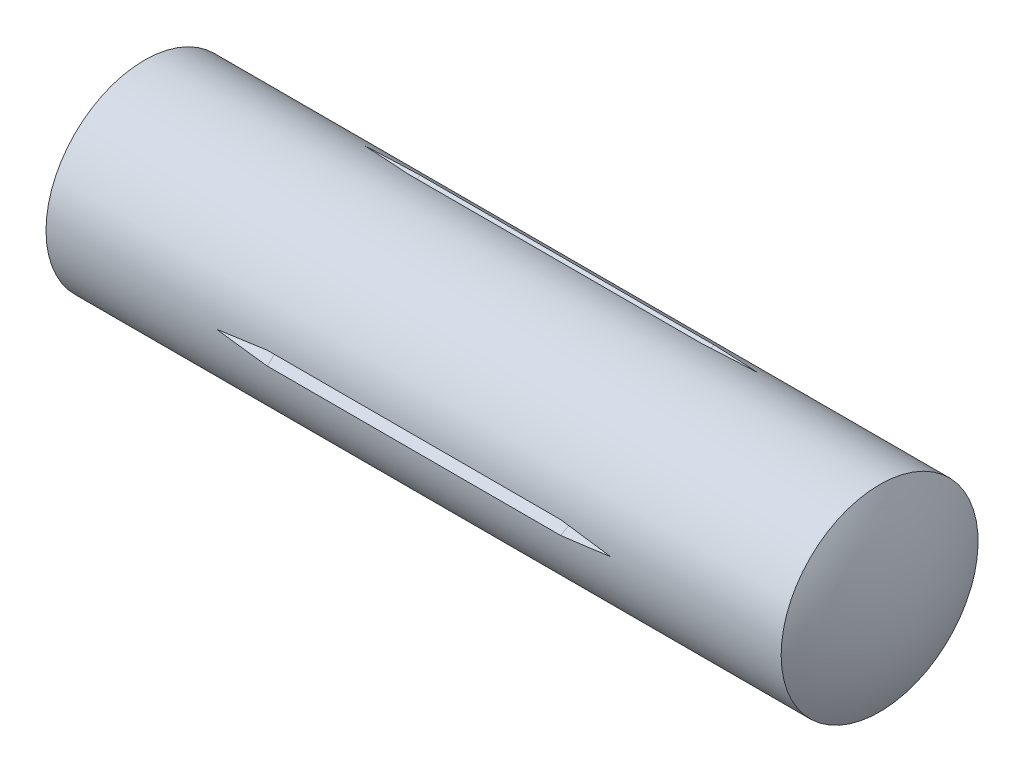
ISO-10303-21;
HEADER;
FILE_DESCRIPTION(('STEP AP214'),'2;1');
FILE_NAME('part.step','',(''),(''),'','','');
FILE_SCHEMA(('AUTOMOTIVE_DESIGN { 1 0 10303 214 1 1 1 1 }'));
ENDSEC;
DATA;
#1=APPLICATION_CONTEXT('core data for automotive mechanical design processes');
#2=APPLICATION_PROTOCOL_DEFINITION('international standard','automotive_design',2000,#1);
#3=PRODUCT_CONTEXT('',#1,'mechanical');
#4=PRODUCT('Part','Part','',(#3));
#5=PRODUCT_RELATED_PRODUCT_CATEGORY('part','',(#4));
#6=PRODUCT_DEFINITION_FORMATION('','',#4);
#7=PRODUCT_DEFINITION_CONTEXT('part definition',#1,'design');
#8=PRODUCT_DEFINITION('design','',#6,#7);
#9=PRODUCT_DEFINITION_SHAPE('','',#8);
#10=(LENGTH_UNIT() NAMED_UNIT(*) SI_UNIT(.MILLI.,.METRE.));
#11=(NAMED_UNIT(*) PLANE_ANGLE_UNIT() SI_UNIT($,.RADIAN.));
#12=(NAMED_UNIT(*) SI_UNIT($,.STERADIAN.) SOLID_ANGLE_UNIT());
#13=UNCERTAINTY_MEASURE_WITH_UNIT(LENGTH_MEASURE(1.E-05),#10,'distance_accuracy_value','');
#14=(GEOMETRIC_REPRESENTATION_CONTEXT(3) GLOBAL_UNCERTAINTY_ASSIGNED_CONTEXT((#13)) GLOBAL_UNIT_ASSIGNED_CONTEXT((#10,
#11,#12)) REPRESENTATION_CONTEXT('',''));
#15=CARTESIAN_POINT('',(0.,0.,0.));
#16=DIRECTION('',(0.,0.,1.));
#17=DIRECTION('',(1.,0.,0.));
#18=AXIS2_PLACEMENT_3D('',#15,#16,#17);
#19=CARTESIAN_POINT('',(-57.,0.,0.));
#20=DIRECTION('',(-1.,0.,0.));
#21=DIRECTION('',(0.,0.,1.));
#22=AXIS2_PLACEMENT_3D('',#19,#20,#21);
#23=CYLINDRICAL_SURFACE('',#22,12.5);
#24=CARTESIAN_POINT('',(-37.4999999999999,0.,0.));
#25=DIRECTION('',(-0.113967852703763,-0.0865878741022106,-0.989703929773219));
#26=DIRECTION('',(-0.993484438000965,0.00993295285175184,0.11353417061639));
#27=AXIS2_PLACEMENT_3D('',#24,#25,#26);
#28=ELLIPSE('',#27,109.68005190456,12.5);
#29=CARTESIAN_POINT('',(25.,-10.8253175473055,-6.25000000000005));
#30=VERTEX_POINT('',#29);
#31=CARTESIAN_POINT('',(18.6292333999212,-11.2344625922933,-5.48058849598867));
#32=VERTEX_POINT('',#31);
#33=EDGE_CURVE('E230',#30,#32,#28,.T.);
#34=ORIENTED_EDGE('',*,*,#33,.F.);
#35=CARTESIAN_POINT('',(-37.4999999999999,0.,0.));
#36=DIRECTION('',(-0.113967852703764,-0.900402682460007,0.419864666254398));
#37=DIRECTION('',(-0.993484438000965,0.103289952377267,-0.0481648958039839));
#38=AXIS2_PLACEMENT_3D('',#35,#36,#37);
#39=ELLIPSE('',#38,109.68005190456,12.5);
#40=CARTESIAN_POINT('',(18.6292333999212,-10.3635601613615,-6.9890357547977));
#41=VERTEX_POINT('',#40);
#42=EDGE_CURVE('E228',#41,#30,#39,.T.);
#43=ORIENTED_EDGE('',*,*,#42,.F.);
#44=DIRECTION('',(-1.,0.,0.));
#45=VECTOR('',#44,1.);
#46=CARTESIAN_POINT('',(-57.,-10.3635601613615,-6.9890357547977));
#47=LINE('',#46,#45);
#48=CARTESIAN_POINT('',(-18.6292333999212,-10.3635601613615,-6.98903575479771));
#49=VERTEX_POINT('',#48);
#50=EDGE_CURVE('E222',#41,#49,#47,.T.);
#51=ORIENTED_EDGE('',*,*,#50,.T.);
#52=CARTESIAN_POINT('',(37.4999999999999,0.,0.));
#53=DIRECTION('',(0.113967852703764,-0.900402682460007,0.419864666254398));
#54=DIRECTION('',(-0.993484438000965,-0.103289952377267,0.0481648958039839));
#55=AXIS2_PLACEMENT_3D('',#52,#53,#54);
#56=ELLIPSE('',#55,109.68005190456,12.5);
#57=CARTESIAN_POINT('',(-25.,-10.8253175473055,-6.25000000000006));
#58=VERTEX_POINT('',#57);
#59=EDGE_CURVE('E218',#58,#49,#56,.T.);
#60=ORIENTED_EDGE('',*,*,#59,.F.);
#61=CARTESIAN_POINT('',(37.4999999999999,0.,0.));
#62=DIRECTION('',(0.113967852703763,-0.0865878741022106,-0.989703929773219));
#63=DIRECTION('',(-0.993484438000965,-0.00993295285175183,-0.11353417061639));
#64=AXIS2_PLACEMENT_3D('',#61,#62,#63);
#65=ELLIPSE('',#64,109.68005190456,12.5);
#66=CARTESIAN_POINT('',(-18.6292333999212,-11.2344625922933,-5.48058849598867));
#67=VERTEX_POINT('',#66);
#68=EDGE_CURVE('E220',#67,#58,#65,.T.);
#69=ORIENTED_EDGE('',*,*,#68,.F.);
#70=DIRECTION('',(-1.,0.,0.));
#71=VECTOR('',#70,1.);
#72=CARTESIAN_POINT('',(-57.,-11.2344625922933,-5.48058849598867));
#73=LINE('',#72,#71);
#74=EDGE_CURVE('E225',#67,#32,#73,.F.);
#75=ORIENTED_EDGE('',*,*,#74,.T.);
#76=EDGE_LOOP('',(#34,#43,#51,#60,#69,#75));
#77=FACE_BOUND('',#76,.T.);
#78=CARTESIAN_POINT('',(46.6506350946109,0.,0.));
#79=DIRECTION('',(-1.,0.,0.));
#80=DIRECTION('',(0.,0.,1.));
#81=AXIS2_PLACEMENT_3D('',#78,#79,#80);
#82=CIRCLE('',#81,12.5);
#83=CARTESIAN_POINT('',(46.6506350946109,0.,12.5));
#84=VERTEX_POINT('',#83);
#85=EDGE_CURVE('E197',#84,#84,#82,.T.);
#86=ORIENTED_EDGE('',*,*,#85,.T.);
#87=EDGE_LOOP('',(#86));
#88=FACE_BOUND('',#87,.T.);
#89=CARTESIAN_POINT('',(-46.6819046503132,0.,0.));
#90=DIRECTION('',(-1.,0.,0.));
#91=DIRECTION('',(0.,0.,1.));
#92=AXIS2_PLACEMENT_3D('',#89,#90,#91);
#93=CIRCLE('',#92,12.5);
#94=CARTESIAN_POINT('',(-46.6819046503132,12.5,0.));
#95=VERTEX_POINT('',#94);
#96=EDGE_CURVE('E194',#95,#95,#93,.T.);
#97=ORIENTED_EDGE('',*,*,#96,.F.);
#98=EDGE_LOOP('',(#97));
#99=FACE_BOUND('',#98,.T.);
#100=CARTESIAN_POINT('',(-37.4999999999999,0.,0.));
#101=DIRECTION('',(-0.113967852703763,-0.81381480835779,0.569839263518816));
#102=DIRECTION('',(-0.993484438000965,0.0933569995255144,-0.0653692748124057));
#103=AXIS2_PLACEMENT_3D('',#100,#101,#102);
#104=ELLIPSE('',#103,109.68005190456,12.5);
#105=CARTESIAN_POINT('',(25.,0.,12.5));
#106=VERTEX_POINT('',#105);
#107=CARTESIAN_POINT('',(18.6292333999212,0.87090243093175,12.4696242507863));
#108=VERTEX_POINT('',#107);
#109=EDGE_CURVE('E216',#106,#108,#104,.T.);
#110=ORIENTED_EDGE('',*,*,#109,.F.);
#111=CARTESIAN_POINT('',(-37.4999999999999,0.,0.));
#112=DIRECTION('',(-0.113967852703764,0.81381480835779,0.569839263518817));
#113=DIRECTION('',(-0.993484438000965,-0.0933569995255145,-0.0653692748124058));
#114=AXIS2_PLACEMENT_3D('',#111,#112,#113);
#115=ELLIPSE('',#114,109.68005190456,12.5);
#116=CARTESIAN_POINT('',(18.6292333999212,-0.870902430931754,12.4696242507863));
#117=VERTEX_POINT('',#116);
#118=EDGE_CURVE('E214',#117,#106,#115,.T.);
#119=ORIENTED_EDGE('',*,*,#118,.F.);
#120=DIRECTION('',(-1.,0.,0.));
#121=VECTOR('',#120,1.);
#122=CARTESIAN_POINT('',(-57.,-0.870902430931754,12.4696242507863));
#123=LINE('',#122,#121);
#124=CARTESIAN_POINT('',(-18.6292333999212,-0.870902430931757,12.4696242507863));
#125=VERTEX_POINT('',#124);
#126=EDGE_CURVE('E208',#117,#125,#123,.T.);
#127=ORIENTED_EDGE('',*,*,#126,.T.);
#128=CARTESIAN_POINT('',(37.4999999999999,0.,0.));
#129=DIRECTION('',(0.113967852703764,0.813814808357789,0.569839263518817));
#130=DIRECTION('',(-0.993484438000965,0.0933569995255145,0.0653692748124058));
#131=AXIS2_PLACEMENT_3D('',#128,#129,#130);
#132=ELLIPSE('',#131,109.68005190456,12.5);
#133=CARTESIAN_POINT('',(-25.,0.,12.5));
#134=VERTEX_POINT('',#133);
#135=EDGE_CURVE('E203',#134,#125,#132,.T.);
#136=ORIENTED_EDGE('',*,*,#135,.F.);
#137=CARTESIAN_POINT('',(37.4999999999999,0.,0.));
#138=DIRECTION('',(0.113967852703763,-0.81381480835779,0.569839263518816));
#139=DIRECTION('',(-0.993484438000965,-0.0933569995255144,0.0653692748124057));
#140=AXIS2_PLACEMENT_3D('',#137,#138,#139);
#141=ELLIPSE('',#140,109.68005190456,12.5);
#142=CARTESIAN_POINT('',(-18.6292333999212,0.87090243093175,12.4696242507863));
#143=VERTEX_POINT('',#142);
#144=EDGE_CURVE('E205',#143,#134,#141,.T.);
#145=ORIENTED_EDGE('',*,*,#144,.F.);
#146=DIRECTION('',(-1.,0.,0.));
#147=VECTOR('',#146,1.);
#148=CARTESIAN_POINT('',(-57.,0.870902430931749,12.4696242507863));
#149=LINE('',#148,#147);
#150=EDGE_CURVE('E211',#143,#108,#149,.F.);
#151=ORIENTED_EDGE('',*,*,#150,.T.);
#152=EDGE_LOOP('',(#110,#119,#127,#136,#145,#151));
#153=FACE_BOUND('',#152,.T.);
#154=CARTESIAN_POINT('',(-37.4999999999999,0.,0.));
#155=DIRECTION('',(-0.113967852703763,0.900402682460001,0.419864666254411));
#156=DIRECTION('',(-0.993484438000965,-0.103289952377266,-0.0481648958039854));
#157=AXIS2_PLACEMENT_3D('',#154,#155,#156);
#158=ELLIPSE('',#157,109.68005190456,12.5);
#159=CARTESIAN_POINT('',(25.,10.8253175473055,-6.2499999999999));
#160=VERTEX_POINT('',#159);
#161=CARTESIAN_POINT('',(18.6292333999212,10.3635601613616,-6.98903575479756));
#162=VERTEX_POINT('',#161);
#163=EDGE_CURVE('E12',#160,#162,#158,.T.);
#164=ORIENTED_EDGE('',*,*,#163,.F.);
#165=CARTESIAN_POINT('',(-37.4999999999999,0.,0.));
#166=DIRECTION('',(-0.113967852703763,0.086587874102225,-0.989703929773218));
#167=DIRECTION('',(-0.993484438000965,-0.00993295285175348,0.11353417061639));
#168=AXIS2_PLACEMENT_3D('',#165,#166,#167);
#169=ELLIPSE('',#168,109.68005190456,12.5);
#170=CARTESIAN_POINT('',(18.6292333999212,11.2344625922933,-5.48058849598851));
#171=VERTEX_POINT('',#170);
#172=EDGE_CURVE('E46',#171,#160,#169,.T.);
#173=ORIENTED_EDGE('',*,*,#172,.F.);
#174=DIRECTION('',(-1.,0.,0.));
#175=VECTOR('',#174,1.);
#176=CARTESIAN_POINT('',(-57.,11.2344625922933,-5.48058849598851));
#177=LINE('',#176,#175);
#178=CARTESIAN_POINT('',(-18.6292333999212,11.2344625922933,-5.48058849598851));
#179=VERTEX_POINT('',#178);
#180=EDGE_CURVE('E234',#171,#179,#177,.T.);
#181=ORIENTED_EDGE('',*,*,#180,.T.);
#182=CARTESIAN_POINT('',(37.5,0.,0.));
#183=DIRECTION('',(0.113967852703763,0.086587874102225,-0.989703929773218));
#184=DIRECTION('',(-0.993484438000965,0.00993295285175348,-0.11353417061639));
#185=AXIS2_PLACEMENT_3D('',#182,#183,#184);
#186=ELLIPSE('',#185,109.68005190456,12.5);
#187=CARTESIAN_POINT('',(-25.,10.8253175473055,-6.2499999999999));
#188=VERTEX_POINT('',#187);
#189=EDGE_CURVE('E128',#188,#179,#186,.T.);
#190=ORIENTED_EDGE('',*,*,#189,.F.);
#191=CARTESIAN_POINT('',(37.4999999999999,0.,0.));
#192=DIRECTION('',(0.113967852703763,0.900402682460001,0.419864666254411));
#193=DIRECTION('',(-0.993484438000965,0.103289952377266,0.0481648958039854));
#194=AXIS2_PLACEMENT_3D('',#191,#192,#193);
#195=ELLIPSE('',#194,109.68005190456,12.5);
#196=CARTESIAN_POINT('',(-18.6292333999212,10.3635601613616,-6.98903575479756));
#197=VERTEX_POINT('',#196);
#198=EDGE_CURVE('E152',#197,#188,#195,.T.);
#199=ORIENTED_EDGE('',*,*,#198,.F.);
#200=DIRECTION('',(-1.,0.,0.));
#201=VECTOR('',#200,1.);
#202=CARTESIAN_POINT('',(-57.,10.3635601613616,-6.98903575479756));
#203=LINE('',#202,#201);
#204=EDGE_CURVE('E147',#197,#162,#203,.F.);
#205=ORIENTED_EDGE('',*,*,#204,.T.);
#206=EDGE_LOOP('',(#164,#173,#181,#190,#199,#205));
#207=FACE_BOUND('',#206,.T.);
#208=ADVANCED_FACE('F38',(#77,#88,#99,#153,#207),#23,.T.);
#209=CARTESIAN_POINT('',(-25.0312695557023,0.,0.));
#210=DIRECTION('',(-1.,0.,0.));
#211=DIRECTION('',(0.,1.,0.));
#212=AXIS2_PLACEMENT_3D('',#209,#210,#211);
#213=SPHERICAL_SURFACE('',#212,25.);
#214=CARTESIAN_POINT('',(-50.,0.,0.));
#215=DIRECTION('',(-1.,0.,0.));
#216=DIRECTION('',(0.,0.,1.));
#217=AXIS2_PLACEMENT_3D('',#214,#215,#216);
#218=CIRCLE('',#217,1.25);
#219=CARTESIAN_POINT('',(-50.,1.25000000000009,0.));
#220=VERTEX_POINT('',#219);
#221=EDGE_CURVE('E200',#220,#220,#218,.T.);
#222=CARTESIAN_POINT('',(-50.,1.25000000000009,0.));
#223=CARTESIAN_POINT('',(-49.9938336924778,1.37317333168647,0.));
#224=CARTESIAN_POINT('',(-49.9867558041352,1.49630102540885,0.));
#225=CARTESIAN_POINT('',(-49.9707787305738,1.74243819046344,0.));
#226=CARTESIAN_POINT('',(-49.9618795453548,1.86544766179563,0.));
#227=CARTESIAN_POINT('',(-49.942261742805,2.11132143560765,0.));
#228=CARTESIAN_POINT('',(-49.931543125474,2.23418573808748,0.));
#229=CARTESIAN_POINT('',(-49.9082888288313,2.47974226646468,0.));
#230=CARTESIAN_POINT('',(-49.8957531495194,2.60243449236206,0.));
#231=CARTESIAN_POINT('',(-49.8688674683718,2.84761999567275,0.));
#232=CARTESIAN_POINT('',(-49.854517466536,2.97011327308608,0.));
#233=CARTESIAN_POINT('',(-49.8240062848361,3.21487405159798,0.));
#234=CARTESIAN_POINT('',(-49.8078451049719,3.33714155269656,0.));
#235=CARTESIAN_POINT('',(-49.7737151063308,3.58142400006337,0.));
#236=CARTESIAN_POINT('',(-49.7557462875539,3.70343894633159,0.));
#237=CARTESIAN_POINT('',(-49.718004946655,3.94718956087127,0.));
#238=CARTESIAN_POINT('',(-49.698232424533,4.06892522914272,0.));
#239=CARTESIAN_POINT('',(-49.6568880074031,4.31209062567909,0.));
#240=CARTESIAN_POINT('',(-49.6353161123952,4.433520353944,0.));
#241=CARTESIAN_POINT('',(-49.5903776740829,4.67604727546572,0.));
#242=CARTESIAN_POINT('',(-49.5670111307785,4.79714446872253,0.));
#243=CARTESIAN_POINT('',(-49.5184885135079,5.03897979805612,0.));
#244=CARTESIAN_POINT('',(-49.4933324395417,5.15971793413291,0.));
#245=CARTESIAN_POINT('',(-49.4412362705202,5.40080870557385,0.));
#246=CARTESIAN_POINT('',(-49.414296175465,5.521161340938,0.));
#247=CARTESIAN_POINT('',(-49.3586378645657,5.76145475185168,0.));
#248=CARTESIAN_POINT('',(-49.3299196487216,5.8813955274012,0.));
#249=CARTESIAN_POINT('',(-49.2707113859815,6.12083894978735,0.));
#250=CARTESIAN_POINT('',(-49.2402213390854,6.24034159662397,0.));
#251=CARTESIAN_POINT('',(-49.1774760920364,6.47888258864305,0.));
#252=CARTESIAN_POINT('',(-49.1452208918834,6.59792093382551,0.));
#253=CARTESIAN_POINT('',(-49.078952402712,6.83550725128431,0.));
#254=CARTESIAN_POINT('',(-49.0449391136935,6.95405522356064,0.));
#255=CARTESIAN_POINT('',(-48.9751618962311,7.19063483135451,0.));
#256=CARTESIAN_POINT('',(-48.9393979677872,7.30866646687205,0.));
#257=CARTESIAN_POINT('',(-48.8661273043316,7.54418755038149,0.));
#258=CARTESIAN_POINT('',(-48.8286205693198,7.66167699837338,0.));
#259=CARTESIAN_POINT('',(-48.7518725072875,7.89608797481216,0.));
#260=CARTESIAN_POINT('',(-48.712631180267,8.01300950325904,0.));
#261=CARTESIAN_POINT('',(-48.6324225286792,8.24625903297168,0.));
#262=CARTESIAN_POINT('',(-48.5914552041119,8.36258703423744,0.));
#263=CARTESIAN_POINT('',(-48.5078035299129,8.59462403194338,0.));
#264=CARTESIAN_POINT('',(-48.4651191802811,8.71033302838357,0.));
#265=CARTESIAN_POINT('',(-48.3780428044906,8.94110667436572,0.));
#266=CARTESIAN_POINT('',(-48.3336507783319,9.05617132390769,0.));
#267=CARTESIAN_POINT('',(-48.2431687720324,9.28563107514239,0.));
#268=CARTESIAN_POINT('',(-48.1970787918916,9.40002617683512,0.));
#269=CARTESIAN_POINT('',(-48.1032109720534,9.62812177806314,0.));
#270=CARTESIAN_POINT('',(-48.055433132356,9.74182227759843,0.));
#271=CARTESIAN_POINT('',(-47.9582000574885,9.96850377232686,0.));
#272=CARTESIAN_POINT('',(-47.9087448223184,10.08148476752,0.));
#273=CARTESIAN_POINT('',(-47.8081677879997,10.3067025089814,0.));
#274=CARTESIAN_POINT('',(-47.7570459888512,10.4189392552497,0.));
#275=CARTESIAN_POINT('',(-47.653147022944,10.6426439172087,0.));
#276=CARTESIAN_POINT('',(-47.6003698561855,10.7541118328994,0.));
#277=CARTESIAN_POINT('',(-47.4931717144603,10.9762544207054,0.));
#278=CARTESIAN_POINT('',(-47.4387507394937,11.0869290928207,0.));
#279=CARTESIAN_POINT('',(-47.3282768989746,11.307460953207,0.));
#280=CARTESIAN_POINT('',(-47.272224033422,11.417318141478,0.));
#281=CARTESIAN_POINT('',(-47.1584986934783,11.6361909766944,0.));
#282=CARTESIAN_POINT('',(-47.1008262190871,11.7452066236399,0.));
#283=CARTESIAN_POINT('',(-46.9838742728691,11.9623724890545,0.));
#284=CARTESIAN_POINT('',(-46.9245948010422,12.0705227075236,0.));
#285=CARTESIAN_POINT('',(-46.8044419168537,12.2859340705523,0.));
#286=CARTESIAN_POINT('',(-46.743568504492,12.3931952151119,0.));
#287=CARTESIAN_POINT('',(-46.6819046503132,12.5,0.));
#288=B_SPLINE_CURVE_WITH_KNOTS('',3,(#222,#223,#224,#225,#226,#227,#228,#229,#230,#231,#232,
#233,#234,#235,#236,#237,#238,#239,#240,#241,#242,#243,#244,#245,#246,#247,#248,#249,#250,#251,
#252,#253,#254,#255,#256,#257,#258,#259,#260,#261,#262,#263,#264,#265,#266,#267,#268,#269,#270,
#271,#272,#273,#274,#275,#276,#277,#278,#279,#280,#281,#282,#283,#284,#285,#286,#287),
.UNSPECIFIED.,.F.,.F.,(4,2,2,2,2,2,2,2,2,2,2,2,2,2,2,2,2,2,2,2,2,2,2,2,2,2,2,2,2,2,2,2,4),(0.,
0.369979372671549,0.739958745343092,1.10993811801464,1.47991749068618,1.84989686335773,
2.21987623602928,2.58985560870083,2.95983498137237,3.32981435404392,3.69979372671547,
4.06977309938701,4.43975247205856,4.8097318447301,5.17971121740165,5.5496905900732,
5.91966996274475,6.28964933541629,6.65962870808784,7.02960808075939,7.39958745343093,
7.76956682610248,8.13954619877402,8.50952557144557,8.87950494411712,9.24948431678867,
9.61946368946021,9.98944306213176,10.3594224348033,10.7294018074748,11.0993811801464,
11.4693605528179,11.8393399254895),.UNSPECIFIED.);
#289=EDGE_CURVE('BSEAM40',#220,#95,#288,.T.);
#290=ORIENTED_EDGE('',*,*,#221,.F.);
#291=ORIENTED_EDGE('',*,*,#96,.T.);
#292=ORIENTED_EDGE('',*,*,#289,.T.);
#293=ORIENTED_EDGE('',*,*,#289,.F.);
#294=EDGE_LOOP('',(#290,#292,#291,#293));
#295=FACE_BOUND('',#294,.T.);
#296=ADVANCED_FACE('F40',(#295),#213,.T.);
#297=CARTESIAN_POINT('',(-50.,0.,0.));
#298=DIRECTION('',(1.,0.,0.));
#299=DIRECTION('',(0.,0.,-1.));
#300=AXIS2_PLACEMENT_3D('',#297,#298,#299);
#301=PLANE('',#300);
#302=ORIENTED_EDGE('',*,*,#221,.T.);
#303=EDGE_LOOP('',(#302));
#304=FACE_BOUND('',#303,.T.);
#305=ADVANCED_FACE('F250',(#304),#301,.F.);
#306=CARTESIAN_POINT('',(25.,0.,0.));
#307=DIRECTION('',(-1.,0.,0.));
#308=DIRECTION('',(0.,1.,0.));
#309=AXIS2_PLACEMENT_3D('',#306,#307,#308);
#310=SPHERICAL_SURFACE('',#309,25.);
#311=ORIENTED_EDGE('',*,*,#85,.F.);
#312=EDGE_LOOP('',(#311));
#313=FACE_BOUND('',#312,.T.);
#314=ADVANCED_FACE('F258',(#313),#310,.T.);
#315=CARTESIAN_POINT('',(18.5292343189172,1.59204091359549,13.4795169211867));
#316=DIRECTION('',(-0.113967852703763,-0.81381480835779,0.569839263518816));
#317=DIRECTION('',(0.,-0.573576436351047,-0.819152044288991));
#318=AXIS2_PLACEMENT_3D('',#315,#316,#317);
#319=PLANE('',#318);
#320=ORIENTED_EDGE('',*,*,#109,.T.);
#321=DIRECTION('',(0.0803231708877466,-0.579246619020721,-0.811185270189));
#322=VECTOR('',#321,1.);
#323=CARTESIAN_POINT('',(18.5292343189172,1.59204091359549,13.4795169211867));
#324=LINE('',#323,#322);
#325=CARTESIAN_POINT('',(18.75,0.,11.25));
#326=VERTEX_POINT('',#325);
#327=EDGE_CURVE('E181',#108,#326,#324,.T.);
#328=ORIENTED_EDGE('',*,*,#327,.T.);
#329=DIRECTION('',(0.98058067569092,0.,0.196116135138184));
#330=VECTOR('',#329,1.);
#331=CARTESIAN_POINT('',(18.75,0.,11.25));
#332=LINE('',#331,#330);
#333=EDGE_CURVE('E180',#326,#106,#332,.T.);
#334=ORIENTED_EDGE('',*,*,#333,.T.);
#335=EDGE_LOOP('',(#320,#328,#334));
#336=FACE_BOUND('',#335,.T.);
#337=ADVANCED_FACE('F260',(#336),#319,.T.);
#338=CARTESIAN_POINT('',(18.5292343189172,-1.59204091359549,13.4795169211867));
#339=DIRECTION('',(-0.113967852703764,0.81381480835779,0.569839263518817));
#340=DIRECTION('',(0.,-0.573576436351048,0.819152044288991));
#341=AXIS2_PLACEMENT_3D('',#338,#339,#340);
#342=PLANE('',#341);
#343=ORIENTED_EDGE('',*,*,#118,.T.);
#344=ORIENTED_EDGE('',*,*,#333,.F.);
#345=DIRECTION('',(-0.0803231708877466,-0.579246619020722,0.811185270189));
#346=VECTOR('',#345,1.);
#347=CARTESIAN_POINT('',(18.5292343189172,-1.59204091359549,13.4795169211867));
#348=LINE('',#347,#346);
#349=EDGE_CURVE('E177',#326,#117,#348,.T.);
#350=ORIENTED_EDGE('',*,*,#349,.T.);
#351=EDGE_LOOP('',(#343,#344,#350));
#352=FACE_BOUND('',#351,.T.);
#353=ADVANCED_FACE('F256',(#352),#342,.T.);
#354=CARTESIAN_POINT('',(-18.7714540963046,-0.154715166386701,11.033334662773));
#355=DIRECTION('',(0.,0.81381480835779,-0.581124304858757));
#356=DIRECTION('',(0.,0.581124304858757,0.81381480835779));
#357=AXIS2_PLACEMENT_3D('',#354,#355,#356);
#358=PLANE('',#357);
#359=DIRECTION('',(0.0803231708877466,0.579246619020721,0.811185270189));
#360=VECTOR('',#359,1.);
#361=CARTESIAN_POINT('',(-18.7714540963046,-0.154715166386701,11.033334662773));
#362=LINE('',#361,#360);
#363=CARTESIAN_POINT('',(-18.75,0.,11.25));
#364=VERTEX_POINT('',#363);
#365=EDGE_CURVE('E184',#364,#143,#362,.T.);
#366=ORIENTED_EDGE('',*,*,#365,.F.);
#367=DIRECTION('',(1.,0.,0.));
#368=VECTOR('',#367,1.);
#369=CARTESIAN_POINT('',(-18.75,0.,11.25));
#370=LINE('',#369,#368);
#371=EDGE_CURVE('E183',#364,#326,#370,.T.);
#372=ORIENTED_EDGE('',*,*,#371,.T.);
#373=ORIENTED_EDGE('',*,*,#327,.F.);
#374=ORIENTED_EDGE('',*,*,#150,.F.);
#375=EDGE_LOOP('',(#366,#372,#373,#374));
#376=FACE_BOUND('',#375,.T.);
#377=ADVANCED_FACE('F279',(#376),#358,.F.);
#378=CARTESIAN_POINT('',(-18.7714540963046,0.154715166386698,11.033334662773));
#379=DIRECTION('',(0.,-0.81381480835779,-0.581124304858758));
#380=DIRECTION('',(0.,0.581124304858758,-0.81381480835779));
#381=AXIS2_PLACEMENT_3D('',#378,#379,#380);
#382=PLANE('',#381);
#383=ORIENTED_EDGE('',*,*,#349,.F.);
#384=ORIENTED_EDGE('',*,*,#371,.F.);
#385=DIRECTION('',(-0.0803231708877466,0.579246619020722,-0.811185270189));
#386=VECTOR('',#385,1.);
#387=CARTESIAN_POINT('',(-18.7714540963046,0.154715166386698,11.033334662773));
#388=LINE('',#387,#386);
#389=EDGE_CURVE('E187',#125,#364,#388,.T.);
#390=ORIENTED_EDGE('',*,*,#389,.F.);
#391=ORIENTED_EDGE('',*,*,#126,.F.);
#392=EDGE_LOOP('',(#383,#384,#390,#391));
#393=FACE_BOUND('',#392,.T.);
#394=ADVANCED_FACE('F285',(#393),#382,.F.);
#395=CARTESIAN_POINT('',(-15.4892923161237,0.,10.5978584632247));
#396=DIRECTION('',(0.113967852703763,-0.81381480835779,0.569839263518816));
#397=DIRECTION('',(0.,-0.573576436351047,-0.819152044288991));
#398=AXIS2_PLACEMENT_3D('',#395,#396,#397);
#399=PLANE('',#398);
#400=ORIENTED_EDGE('',*,*,#144,.T.);
#401=DIRECTION('',(-0.98058067569092,0.,0.196116135138184));
#402=VECTOR('',#401,1.);
#403=CARTESIAN_POINT('',(-15.4892923161237,0.,10.5978584632247));
#404=LINE('',#403,#402);
#405=EDGE_CURVE('E176',#364,#134,#404,.T.);
#406=ORIENTED_EDGE('',*,*,#405,.F.);
#407=ORIENTED_EDGE('',*,*,#365,.T.);
#408=EDGE_LOOP('',(#400,#406,#407));
#409=FACE_BOUND('',#408,.T.);
#410=ADVANCED_FACE('F297',(#409),#399,.T.);
#411=CARTESIAN_POINT('',(-15.4892923161237,0.,10.5978584632247));
#412=DIRECTION('',(0.113967852703764,0.813814808357789,0.569839263518817));
#413=DIRECTION('',(0.,-0.573576436351048,0.819152044288991));
#414=AXIS2_PLACEMENT_3D('',#411,#412,#413);
#415=PLANE('',#414);
#416=ORIENTED_EDGE('',*,*,#135,.T.);
#417=ORIENTED_EDGE('',*,*,#389,.T.);
#418=ORIENTED_EDGE('',*,*,#405,.T.);
#419=EDGE_LOOP('',(#416,#417,#418));
#420=FACE_BOUND('',#419,.T.);
#421=ADVANCED_FACE('F299',(#420),#415,.T.);
#422=CARTESIAN_POINT('',(18.5295225694772,-12.466064147333,-5.36135527271965));
#423=DIRECTION('',(-0.113967852703763,-0.0865878741022106,-0.989703929773219));
#424=DIRECTION('',(-0.993435056192829,0.,0.114397504899149));
#425=AXIS2_PLACEMENT_3D('',#422,#423,#424);
#426=PLANE('',#425);
#427=ORIENTED_EDGE('',*,*,#33,.T.);
#428=DIRECTION('',(0.0803231708877466,0.992130360669779,-0.0960496520336863));
#429=VECTOR('',#428,1.);
#430=CARTESIAN_POINT('',(18.5295225694772,-12.466064147333,-5.36135527271965));
#431=LINE('',#430,#429);
#432=CARTESIAN_POINT('',(18.75,-9.74278579257491,-5.62500000000005));
#433=VERTEX_POINT('',#432);
#434=EDGE_CURVE('E163',#32,#433,#431,.T.);
#435=ORIENTED_EDGE('',*,*,#434,.T.);
#436=DIRECTION('',(0.98058067569092,-0.169841555121689,-0.0980580675690929));
#437=VECTOR('',#436,1.);
#438=CARTESIAN_POINT('',(18.75,-9.74278579257491,-5.62500000000005));
#439=LINE('',#438,#437);
#440=EDGE_CURVE('E162',#433,#30,#439,.T.);
#441=ORIENTED_EDGE('',*,*,#440,.T.);
#442=EDGE_LOOP('',(#427,#435,#441));
#443=FACE_BOUND('',#442,.T.);
#444=ADVANCED_FACE('F302',(#443),#426,.T.);
#445=CARTESIAN_POINT('',(18.5295225694772,-10.8761019385553,-8.11525060043704));
#446=DIRECTION('',(-0.113967852703764,-0.900402682460007,0.419864666254398));
#447=DIRECTION('',(0.,-0.422618261740693,-0.906307787036653));
#448=AXIS2_PLACEMENT_3D('',#445,#446,#447);
#449=PLANE('',#448);
#450=ORIENTED_EDGE('',*,*,#42,.T.);
#451=ORIENTED_EDGE('',*,*,#440,.F.);
#452=DIRECTION('',(-0.0803231708877466,-0.412883741649053,-0.907234922222693));
#453=VECTOR('',#452,1.);
#454=CARTESIAN_POINT('',(18.5295225694772,-10.8761019385553,-8.11525060043704));
#455=LINE('',#454,#453);
#456=EDGE_CURVE('E159',#433,#41,#455,.T.);
#457=ORIENTED_EDGE('',*,*,#456,.T.);
#458=EDGE_LOOP('',(#450,#451,#457));
#459=FACE_BOUND('',#458,.T.);
#460=ADVANCED_FACE('F307',(#459),#449,.T.);
#461=CARTESIAN_POINT('',(-18.7717461149635,-9.47418358671792,-5.65100378884754));
#462=DIRECTION('',(0.,0.0963610065853569,0.99534645044319));
#463=DIRECTION('',(0.,-0.99534645044319,0.0963610065853569));
#464=AXIS2_PLACEMENT_3D('',#461,#462,#463);
#465=PLANE('',#464);
#466=DIRECTION('',(0.0803231708877466,-0.992130360669779,0.0960496520336862));
#467=VECTOR('',#466,1.);
#468=CARTESIAN_POINT('',(-18.7717461149635,-9.47418358671792,-5.65100378884754));
#469=LINE('',#468,#467);
#470=CARTESIAN_POINT('',(-18.75,-9.74278579257491,-5.62500000000005));
#471=VERTEX_POINT('',#470);
#472=EDGE_CURVE('E166',#471,#67,#469,.T.);
#473=ORIENTED_EDGE('',*,*,#472,.F.);
#474=DIRECTION('',(1.,0.,0.));
#475=VECTOR('',#474,1.);
#476=CARTESIAN_POINT('',(-18.75,-9.74278579257491,-5.62500000000005));
#477=LINE('',#476,#475);
#478=EDGE_CURVE('E165',#471,#433,#477,.T.);
#479=ORIENTED_EDGE('',*,*,#478,.T.);
#480=ORIENTED_EDGE('',*,*,#434,.F.);
#481=ORIENTED_EDGE('',*,*,#74,.F.);
#482=EDGE_LOOP('',(#473,#479,#480,#481));
#483=FACE_BOUND('',#482,.T.);
#484=ADVANCED_FACE('F310',(#483),#465,.F.);
#485=CARTESIAN_POINT('',(-18.7717461149635,-9.63100463138299,-5.37938177179161));
#486=DIRECTION('',(0.,0.910175814943154,-0.414222145584427));
#487=DIRECTION('',(0.,0.414222145584427,0.910175814943154));
#488=AXIS2_PLACEMENT_3D('',#485,#486,#487);
#489=PLANE('',#488);
#490=ORIENTED_EDGE('',*,*,#456,.F.);
#491=ORIENTED_EDGE('',*,*,#478,.F.);
#492=DIRECTION('',(-0.0803231708877466,0.412883741649053,0.907234922222693));
#493=VECTOR('',#492,1.);
#494=CARTESIAN_POINT('',(-18.7717461149635,-9.63100463138299,-5.37938177179161));
#495=LINE('',#494,#493);
#496=EDGE_CURVE('E169',#49,#471,#495,.T.);
#497=ORIENTED_EDGE('',*,*,#496,.F.);
#498=ORIENTED_EDGE('',*,*,#50,.F.);
#499=EDGE_LOOP('',(#490,#491,#497,#498));
#500=FACE_BOUND('',#499,.T.);
#501=ADVANCED_FACE('F315',(#500),#489,.F.);
#502=CARTESIAN_POINT('',(-15.4449097669272,-9.17032737184674,-5.29449097669276));
#503=DIRECTION('',(0.113967852703763,-0.0865878741022106,-0.989703929773219));
#504=DIRECTION('',(-0.993435056192829,0.,-0.114397504899149));
#505=AXIS2_PLACEMENT_3D('',#502,#503,#504);
#506=PLANE('',#505);
#507=ORIENTED_EDGE('',*,*,#68,.T.);
#508=DIRECTION('',(-0.98058067569092,-0.169841555121689,-0.0980580675690929));
#509=VECTOR('',#508,1.);
#510=CARTESIAN_POINT('',(-15.4449097669272,-9.17032737184674,-5.29449097669276));
#511=LINE('',#510,#509);
#512=EDGE_CURVE('E61',#471,#58,#511,.T.);
#513=ORIENTED_EDGE('',*,*,#512,.F.);
#514=ORIENTED_EDGE('',*,*,#472,.T.);
#515=EDGE_LOOP('',(#507,#513,#514));
#516=FACE_BOUND('',#515,.T.);
#517=ADVANCED_FACE('F318',(#516),#506,.T.);
#518=CARTESIAN_POINT('',(-15.4449097669272,-9.17032737184674,-5.29449097669276));
#519=DIRECTION('',(0.113967852703764,-0.900402682460007,0.419864666254398));
#520=DIRECTION('',(0.,-0.422618261740693,-0.906307787036653));
#521=AXIS2_PLACEMENT_3D('',#518,#519,#520);
#522=PLANE('',#521);
#523=ORIENTED_EDGE('',*,*,#59,.T.);
#524=ORIENTED_EDGE('',*,*,#496,.T.);
#525=ORIENTED_EDGE('',*,*,#512,.T.);
#526=EDGE_LOOP('',(#523,#524,#525));
#527=FACE_BOUND('',#526,.T.);
#528=ADVANCED_FACE('F323',(#527),#522,.T.);
#529=CARTESIAN_POINT('',(18.5295225694772,10.8761019385554,-8.11525060043688));
#530=DIRECTION('',(-0.113967852703763,0.900402682460001,0.419864666254411));
#531=DIRECTION('',(0.,-0.422618261740707,0.906307787036647));
#532=AXIS2_PLACEMENT_3D('',#529,#530,#531);
#533=PLANE('',#532);
#534=ORIENTED_EDGE('',*,*,#163,.T.);
#535=DIRECTION('',(0.0803231708877466,-0.412883741649066,0.907234922222687));
#536=VECTOR('',#535,1.);
#537=CARTESIAN_POINT('',(18.5295225694772,10.8761019385554,-8.11525060043688));
#538=LINE('',#537,#536);
#539=CARTESIAN_POINT('',(18.75,9.74278579257499,-5.62499999999991));
#540=VERTEX_POINT('',#539);
#541=EDGE_CURVE('E142',#162,#540,#538,.T.);
#542=ORIENTED_EDGE('',*,*,#541,.T.);
#543=DIRECTION('',(0.98058067569092,0.16984155512169,-0.0980580675690905));
#544=VECTOR('',#543,1.);
#545=CARTESIAN_POINT('',(18.75,9.74278579257499,-5.62499999999991));
#546=LINE('',#545,#544);
#547=EDGE_CURVE('E156',#540,#160,#546,.T.);
#548=ORIENTED_EDGE('',*,*,#547,.T.);
#549=EDGE_LOOP('',(#534,#542,#548));
#550=FACE_BOUND('',#549,.T.);
#551=ADVANCED_FACE('F243',(#550),#533,.T.);
#552=CARTESIAN_POINT('',(18.5295225694772,12.4660641473331,-5.36135527271948));
#553=DIRECTION('',(-0.113967852703763,0.086587874102225,-0.989703929773218));
#554=DIRECTION('',(-0.993435056192829,0.,0.11439750489915));
#555=AXIS2_PLACEMENT_3D('',#552,#553,#554);
#556=PLANE('',#555);
#557=ORIENTED_EDGE('',*,*,#172,.T.);
#558=ORIENTED_EDGE('',*,*,#547,.F.);
#559=DIRECTION('',(-0.0803231708877466,0.992130360669777,0.0960496520337006));
#560=VECTOR('',#559,1.);
#561=CARTESIAN_POINT('',(18.5295225694772,12.4660641473331,-5.36135527271948));
#562=LINE('',#561,#560);
#563=EDGE_CURVE('E139',#540,#171,#562,.T.);
#564=ORIENTED_EDGE('',*,*,#563,.T.);
#565=EDGE_LOOP('',(#557,#558,#564));
#566=FACE_BOUND('',#565,.T.);
#567=ADVANCED_FACE('F239',(#566),#556,.T.);
#568=CARTESIAN_POINT('',(-18.7717461149635,9.63100463138307,-5.37938177179147));
#569=DIRECTION('',(0.,-0.910175814943147,-0.41422214558444));
#570=DIRECTION('',(0.,0.41422214558444,-0.910175814943148));
#571=AXIS2_PLACEMENT_3D('',#568,#569,#570);
#572=PLANE('',#571);
#573=DIRECTION('',(0.0803231708877466,0.412883741649066,-0.907234922222687));
#574=VECTOR('',#573,1.);
#575=CARTESIAN_POINT('',(-18.7717461149635,9.63100463138307,-5.37938177179147));
#576=LINE('',#575,#574);
#577=CARTESIAN_POINT('',(-18.75,9.74278579257499,-5.62499999999991));
#578=VERTEX_POINT('',#577);
#579=EDGE_CURVE('E132',#578,#197,#576,.T.);
#580=ORIENTED_EDGE('',*,*,#579,.F.);
#581=DIRECTION('',(1.,0.,0.));
#582=VECTOR('',#581,1.);
#583=CARTESIAN_POINT('',(-18.75,9.74278579257499,-5.62499999999991));
#584=LINE('',#583,#582);
#585=EDGE_CURVE('E131',#578,#540,#584,.T.);
#586=ORIENTED_EDGE('',*,*,#585,.T.);
#587=ORIENTED_EDGE('',*,*,#541,.F.);
#588=ORIENTED_EDGE('',*,*,#204,.F.);
#589=EDGE_LOOP('',(#580,#586,#587,#588));
#590=FACE_BOUND('',#589,.T.);
#591=ADVANCED_FACE('F145',(#590),#572,.F.);
#592=CARTESIAN_POINT('',(-18.7717461149635,9.474183586718,-5.65100378884741));
#593=DIRECTION('',(0.,-0.0963610065853713,0.995346450443188));
#594=DIRECTION('',(0.,-0.995346450443188,-0.0963610065853713));
#595=AXIS2_PLACEMENT_3D('',#592,#593,#594);
#596=PLANE('',#595);
#597=ORIENTED_EDGE('',*,*,#563,.F.);
#598=ORIENTED_EDGE('',*,*,#585,.F.);
#599=DIRECTION('',(-0.0803231708877466,-0.992130360669777,-0.0960496520337006));
#600=VECTOR('',#599,1.);
#601=CARTESIAN_POINT('',(-18.7717461149635,9.474183586718,-5.65100378884741));
#602=LINE('',#601,#600);
#603=EDGE_CURVE('E124',#179,#578,#602,.T.);
#604=ORIENTED_EDGE('',*,*,#603,.F.);
#605=ORIENTED_EDGE('',*,*,#180,.F.);
#606=EDGE_LOOP('',(#597,#598,#604,#605));
#607=FACE_BOUND('',#606,.T.);
#608=ADVANCED_FACE('F137',(#607),#596,.F.);
#609=CARTESIAN_POINT('',(-15.4449097669272,9.17032737184681,-5.29449097669263));
#610=DIRECTION('',(0.113967852703763,0.900402682460001,0.419864666254411));
#611=DIRECTION('',(0.,-0.422618261740707,0.906307787036647));
#612=AXIS2_PLACEMENT_3D('',#609,#610,#611);
#613=PLANE('',#612);
#614=ORIENTED_EDGE('',*,*,#198,.T.);
#615=DIRECTION('',(-0.98058067569092,0.16984155512169,-0.0980580675690905));
#616=VECTOR('',#615,1.);
#617=CARTESIAN_POINT('',(-15.4449097669272,9.17032737184681,-5.29449097669263));
#618=LINE('',#617,#616);
#619=EDGE_CURVE('E53',#578,#188,#618,.T.);
#620=ORIENTED_EDGE('',*,*,#619,.F.);
#621=ORIENTED_EDGE('',*,*,#579,.T.);
#622=EDGE_LOOP('',(#614,#620,#621));
#623=FACE_BOUND('',#622,.T.);
#624=ADVANCED_FACE('F151',(#623),#613,.T.);
#625=CARTESIAN_POINT('',(-15.4449097669272,9.17032737184681,-5.29449097669263));
#626=DIRECTION('',(0.113967852703763,0.086587874102225,-0.989703929773218));
#627=DIRECTION('',(-0.993435056192829,0.,-0.11439750489915));
#628=AXIS2_PLACEMENT_3D('',#625,#626,#627);
#629=PLANE('',#628);
#630=ORIENTED_EDGE('',*,*,#189,.T.);
#631=ORIENTED_EDGE('',*,*,#603,.T.);
#632=ORIENTED_EDGE('',*,*,#619,.T.);
#633=EDGE_LOOP('',(#630,#631,#632));
#634=FACE_BOUND('',#633,.T.);
#635=ADVANCED_FACE('F126',(#634),#629,.T.);
#636=CLOSED_SHELL('',(#208,#296,#305,#314,#337,#353,#377,#394,#410,#421,#444,#460,#484,#501,
#517,#528,#551,#567,#591,#608,#624,#635));
#637=MANIFOLD_SOLID_BREP('B2',#636);
#638=ADVANCED_BREP_SHAPE_REPRESENTATION('',(#18,#637),#14);
#639=SHAPE_DEFINITION_REPRESENTATION(#9,#638);
ENDSEC;
END-ISO-10303-21;
